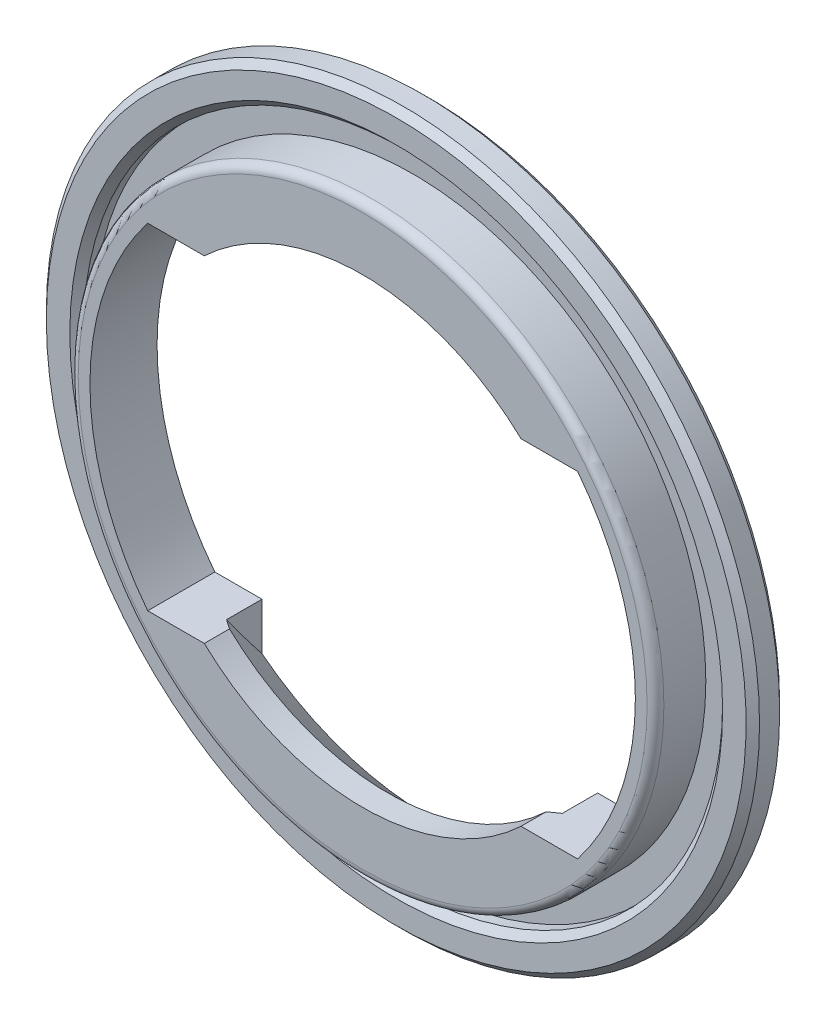
ISO-10303-21;
HEADER;
FILE_DESCRIPTION(('STEP AP214'),'2;1');
FILE_NAME('part.step','',(''),(''),'','','');
FILE_SCHEMA(('AUTOMOTIVE_DESIGN { 1 0 10303 214 1 1 1 1 }'));
ENDSEC;
DATA;
#1=APPLICATION_CONTEXT('core data for automotive mechanical design processes');
#2=APPLICATION_PROTOCOL_DEFINITION('international standard','automotive_design',2000,#1);
#3=PRODUCT_CONTEXT('',#1,'mechanical');
#4=PRODUCT('Part','Part','',(#3));
#5=PRODUCT_RELATED_PRODUCT_CATEGORY('part','',(#4));
#6=PRODUCT_DEFINITION_FORMATION('','',#4);
#7=PRODUCT_DEFINITION_CONTEXT('part definition',#1,'design');
#8=PRODUCT_DEFINITION('design','',#6,#7);
#9=PRODUCT_DEFINITION_SHAPE('','',#8);
#10=(LENGTH_UNIT() NAMED_UNIT(*) SI_UNIT(.MILLI.,.METRE.));
#11=(NAMED_UNIT(*) PLANE_ANGLE_UNIT() SI_UNIT($,.RADIAN.));
#12=(NAMED_UNIT(*) SI_UNIT($,.STERADIAN.) SOLID_ANGLE_UNIT());
#13=UNCERTAINTY_MEASURE_WITH_UNIT(LENGTH_MEASURE(1.E-05),#10,'distance_accuracy_value','');
#14=(GEOMETRIC_REPRESENTATION_CONTEXT(3) GLOBAL_UNCERTAINTY_ASSIGNED_CONTEXT((#13)) GLOBAL_UNIT_ASSIGNED_CONTEXT((#10,
#11,#12)) REPRESENTATION_CONTEXT('',''));
#15=CARTESIAN_POINT('',(0.,0.,0.));
#16=DIRECTION('',(0.,0.,1.));
#17=DIRECTION('',(1.,0.,0.));
#18=AXIS2_PLACEMENT_3D('',#15,#16,#17);
#19=CARTESIAN_POINT('',(0.,0.,28.0821917808219));
#20=DIRECTION('',(0.,0.,1.));
#21=DIRECTION('',(1.,0.,0.));
#22=AXIS2_PLACEMENT_3D('',#19,#20,#21);
#23=CYLINDRICAL_SURFACE('',#22,27.5);
#24=CARTESIAN_POINT('',(0.,0.,-3.));
#25=DIRECTION('',(0.,0.,-1.));
#26=DIRECTION('',(-1.,0.,0.));
#27=AXIS2_PLACEMENT_3D('',#24,#25,#26);
#28=CIRCLE('',#27,27.5);
#29=CARTESIAN_POINT('',(18.8745860881769,20.,-3.));
#30=VERTEX_POINT('',#29);
#31=CARTESIAN_POINT('',(-18.8745860881769,20.,-3.));
#32=VERTEX_POINT('',#31);
#33=EDGE_CURVE('E196',#30,#32,#28,.F.);
#34=ORIENTED_EDGE('',*,*,#33,.F.);
#35=DIRECTION('',(0.,0.,1.));
#36=VECTOR('',#35,1.);
#37=CARTESIAN_POINT('',(18.8745860881769,20.,28.0821917808219));
#38=LINE('',#37,#36);
#39=CARTESIAN_POINT('',(18.8745860881769,20.,0.));
#40=VERTEX_POINT('',#39);
#41=EDGE_CURVE('E408',#40,#30,#38,.F.);
#42=ORIENTED_EDGE('',*,*,#41,.F.);
#43=CARTESIAN_POINT('',(0.,0.,0.));
#44=DIRECTION('',(0.,0.,1.));
#45=DIRECTION('',(1.,0.,0.));
#46=AXIS2_PLACEMENT_3D('',#43,#44,#45);
#47=CIRCLE('',#46,27.5);
#48=CARTESIAN_POINT('',(-18.8745860881769,20.,0.));
#49=VERTEX_POINT('',#48);
#50=EDGE_CURVE('E418',#40,#49,#47,.T.);
#51=ORIENTED_EDGE('',*,*,#50,.T.);
#52=DIRECTION('',(0.,0.,1.));
#53=VECTOR('',#52,1.);
#54=CARTESIAN_POINT('',(-18.8745860881769,20.,28.0821917808219));
#55=LINE('',#54,#53);
#56=EDGE_CURVE('E405',#32,#49,#55,.T.);
#57=ORIENTED_EDGE('',*,*,#56,.F.);
#58=EDGE_LOOP('',(#34,#42,#51,#57));
#59=FACE_BOUND('',#58,.T.);
#60=ADVANCED_FACE('F36',(#59),#23,.F.);
#61=CARTESIAN_POINT('',(0.,0.,-8.));
#62=DIRECTION('',(0.,0.,-1.));
#63=DIRECTION('',(-1.,0.,0.));
#64=AXIS2_PLACEMENT_3D('',#61,#62,#63);
#65=CONICAL_SURFACE('',#64,28.3,0.785398163397442);
#66=CARTESIAN_POINT('',(0.,0.,-8.));
#67=DIRECTION('',(0.,0.,1.));
#68=DIRECTION('',(1.,0.,0.));
#69=AXIS2_PLACEMENT_3D('',#66,#67,#68);
#70=CIRCLE('',#69,28.3);
#71=CARTESIAN_POINT('',(-20.,20.0222376371873,-8.));
#72=VERTEX_POINT('',#71);
#73=CARTESIAN_POINT('',(-20.0222376371873,20.,-8.));
#74=VERTEX_POINT('',#73);
#75=EDGE_CURVE('E429',#72,#74,#70,.T.);
#76=ORIENTED_EDGE('',*,*,#75,.F.);
#77=CARTESIAN_POINT('',(-20.,27.4636148764837,-13.6742570497696));
#78=CARTESIAN_POINT('',(-20.,26.9400176394358,-13.2510434309802));
#79=CARTESIAN_POINT('',(-20.,26.414401457281,-12.8303067182426));
#80=CARTESIAN_POINT('',(-20.,25.3584905949147,-11.9947064751424));
#81=CARTESIAN_POINT('',(-20.,24.8281957336181,-11.5798431737389));
#82=CARTESIAN_POINT('',(-20.,23.7630525449101,-10.7575019289592));
#83=CARTESIAN_POINT('',(-20.,23.2282113936961,-10.3500147060618));
#84=CARTESIAN_POINT('',(-20.,22.1525072374824,-9.54303963473138));
#85=CARTESIAN_POINT('',(-20.,21.6116441456833,-9.14355190183476));
#86=CARTESIAN_POINT('',(-20.,20.5226537266135,-8.3537721076442));
#87=CARTESIAN_POINT('',(-20.,19.97452158685,-7.96348666790359));
#88=CARTESIAN_POINT('',(-20.,18.8703927401923,-7.19426946554557));
#89=CARTESIAN_POINT('',(-20.,18.3143966134008,-6.81533687182659));
#90=CARTESIAN_POINT('',(-20.,17.1925761380692,-6.07059691832123));
#91=CARTESIAN_POINT('',(-20.,16.6267397246452,-5.70480764621374));
#92=CARTESIAN_POINT('',(-20.,15.7701117488427,-5.16854738094426));
#93=CARTESIAN_POINT('',(-20.,15.4832175572613,-4.991841523961));
#94=CARTESIAN_POINT('',(-20.,14.9066261607875,-4.6430328285595));
#95=CARTESIAN_POINT('',(-20.,14.6169288147771,-4.4709302235399));
#96=CARTESIAN_POINT('',(-20.,14.3257429502304,-4.30135994363062));
#97=B_SPLINE_CURVE_WITH_KNOTS('',3,(#77,#78,#79,#80,#81,#82,#83,#84,#85,#86,#87,#88,#89,#90,#91,
#92,#93,#94,#95,#96),.UNSPECIFIED.,.F.,.F.,(4,2,2,2,2,2,2,2,2,4),(0.,2.01975813535382,
4.03959478996089,6.05668357397876,8.07380146977579,10.0923290391449,12.1107084764033,
14.1317667631096,15.1425691699538,16.1534227307229),.UNSPECIFIED.);
#98=CARTESIAN_POINT('',(-20.,20.,-7.98427124746189));
#99=VERTEX_POINT('',#98);
#100=EDGE_CURVE('E453',#72,#99,#97,.T.);
#101=ORIENTED_EDGE('',*,*,#100,.T.);
#102=CARTESIAN_POINT('',(20.0232270248829,20.,-8.00070000000001));
#103=CARTESIAN_POINT('',(19.7436785693038,20.,-7.80291970780977));
#104=CARTESIAN_POINT('',(19.4631605166588,20.,-7.60651124220242));
#105=CARTESIAN_POINT('',(18.9000219227625,20.,-7.21671283287064));
#106=CARTESIAN_POINT('',(18.6174013121765,20.,-7.0233229893467));
#107=CARTESIAN_POINT('',(17.7659318695407,20.,-6.44795331756512));
#108=CARTESIAN_POINT('',(17.1937083614906,20.,-6.07093880226928));
#109=CARTESIAN_POINT('',(16.0317493042842,20.,-5.32839778554733));
#110=CARTESIAN_POINT('',(15.4418843725988,20.,-4.96307309261693));
#111=CARTESIAN_POINT('',(14.2500900654365,20.,-4.25272104888336));
#112=CARTESIAN_POINT('',(13.6481620751407,20.,-3.90769138533751));
#113=CARTESIAN_POINT('',(12.4113652480964,20.,-3.23221540940347));
#114=CARTESIAN_POINT('',(11.7760559490994,20.,-2.90257018063006));
#115=CARTESIAN_POINT('',(10.4889407296726,20.,-2.27657438430796));
#116=CARTESIAN_POINT('',(9.83713170116268,20.,-1.98023014777135));
#117=CARTESIAN_POINT('',(8.51922395365659,20.,-1.43062969296445));
#118=CARTESIAN_POINT('',(7.85321193540946,20.,-1.17716745825001));
#119=CARTESIAN_POINT('',(6.50398771337576,20.,-0.721411113212666));
#120=CARTESIAN_POINT('',(5.82078661098829,20.,-0.519084864915172));
#121=CARTESIAN_POINT('',(4.80336046574302,20.,-0.266281785997138));
#122=CARTESIAN_POINT('',(4.47496750642687,20.,-0.191971799651674));
#123=CARTESIAN_POINT('',(3.8152085780237,20.,-0.0580835184166812));
#124=CARTESIAN_POINT('',(3.48384301971432,20.,0.0014967804068467));
#125=CARTESIAN_POINT('',(2.81856301003291,20.,0.105042987525139));
#126=CARTESIAN_POINT('',(2.48464775735628,20.,0.149003761730995));
#127=CARTESIAN_POINT('',(1.81505578351882,20.,0.220566827937985));
#128=CARTESIAN_POINT('',(1.47937904720048,20.,0.24816897894012));
#129=CARTESIAN_POINT('',(0.811789772154226,20.,0.286266851006239));
#130=CARTESIAN_POINT('',(0.479890691359999,20.,0.296997703229757));
#131=CARTESIAN_POINT('',(-0.184028527002854,20.,0.301908131482201));
#132=CARTESIAN_POINT('',(-0.516048663678199,20.,0.296087827267026));
#133=CARTESIAN_POINT('',(-1.17938590953977,20.,0.267997066546096));
#134=CARTESIAN_POINT('',(-1.51070302516225,20.,0.245726761299852));
#135=CARTESIAN_POINT('',(-2.17185735789146,20.,0.18511528169715));
#136=CARTESIAN_POINT('',(-2.50169456867268,20.,0.146774038715164));
#137=CARTESIAN_POINT('',(-3.15696907717575,20.,0.0549528628154587));
#138=CARTESIAN_POINT('',(-3.48242104433814,20.,0.00157730690424268));
#139=CARTESIAN_POINT('',(-4.13063927664447,20.,-0.119616152504603));
#140=CARTESIAN_POINT('',(-4.45340520224689,20.,-0.187435853909635));
#141=CARTESIAN_POINT('',(-5.41694183388231,20.,-0.41118731673326));
#142=CARTESIAN_POINT('',(-6.05306865107276,20.,-0.587428449095514));
#143=CARTESIAN_POINT('',(-7.31871300047359,20.,-0.988446970722365));
#144=CARTESIAN_POINT('',(-7.94803460526517,20.,-1.21383027988622));
#145=CARTESIAN_POINT('',(-9.19123386949648,20.,-1.70345966154817));
#146=CARTESIAN_POINT('',(-9.80511186785428,20.,-1.96770488032841));
#147=CARTESIAN_POINT('',(-10.8425173495956,20.,-2.44674011966137));
#148=CARTESIAN_POINT('',(-11.2697066834235,20.,-2.65370387565659));
#149=CARTESIAN_POINT('',(-12.1171468476627,20.,-3.08143309489274));
#150=CARTESIAN_POINT('',(-12.5373972282369,20.,-3.30219944851983));
#151=CARTESIAN_POINT('',(-13.3716510792254,20.,-3.75573571624505));
#152=CARTESIAN_POINT('',(-13.7856509130296,20.,-3.98851229456659));
#153=CARTESIAN_POINT('',(-14.6077051512683,20.,-4.46434357125389));
#154=CARTESIAN_POINT('',(-15.0157593688964,20.,-4.7073985916274));
#155=CARTESIAN_POINT('',(-15.8140340056422,20.,-5.19483960343645));
#156=CARTESIAN_POINT('',(-16.2044183028579,20.,-5.43895784739114));
#157=CARTESIAN_POINT('',(-16.9805270375857,20.,-5.93450266128216));
#158=CARTESIAN_POINT('',(-17.3662513605837,20.,-6.18592941030233));
#159=CARTESIAN_POINT('',(-18.1327518006563,20.,-6.69471405515383));
#160=CARTESIAN_POINT('',(-18.5135356293552,20.,-6.95206035520273));
#161=CARTESIAN_POINT('',(-19.2712032795324,20.,-7.47235690044798));
#162=CARTESIAN_POINT('',(-19.6480874765652,20.,-7.73530659840406));
#163=CARTESIAN_POINT('',(-20.0232270248829,20.,-8.00070000000001));
#164=B_SPLINE_CURVE_WITH_KNOTS('',3,(#102,#103,#104,#105,#106,#107,#108,#109,#110,#111,#112,
#113,#114,#115,#116,#117,#118,#119,#120,#121,#122,#123,#124,#125,#126,#127,#128,#129,#130,#131,
#132,#133,#134,#135,#136,#137,#138,#139,#140,#141,#142,#143,#144,#145,#146,#147,#148,#149,#150,
#151,#152,#153,#154,#155,#156,#157,#158,#159,#160,#161,#162,#163),.UNSPECIFIED.,.F.,.F.,(4,2,2,
2,2,2,2,2,2,2,2,2,2,2,2,2,2,2,2,2,2,2,2,2,2,2,2,2,2,2,4),(0.,1.02730901077004,2.05465204994527,
4.11019508478165,6.19136354482817,8.27229438170184,10.4187374283151,12.5655878576303,
14.70181180887,16.8366898274646,17.8465003155718,18.8561733460087,19.8661779464594,
20.8761912522616,21.8719993643707,22.8678002713282,23.8635920219044,24.8593880247172,
25.848434171168,26.8376034992728,28.8155879028914,30.8194992007203,32.8233664832291,
34.2471705746944,35.6710666087161,37.0957614127769,38.5205008834449,39.9016932205685,
41.2829194302914,42.6616382109699,44.0402229544717),.UNSPECIFIED.);
#165=EDGE_CURVE('E293',#99,#74,#164,.T.);
#166=ORIENTED_EDGE('',*,*,#165,.T.);
#167=EDGE_LOOP('',(#76,#101,#166));
#168=FACE_BOUND('',#167,.T.);
#169=ADVANCED_FACE('F371',(#168),#65,.F.);
#170=CARTESIAN_POINT('',(0.,0.,-3.));
#171=DIRECTION('',(0.,0.,-1.));
#172=DIRECTION('',(-1.,0.,0.));
#173=AXIS2_PLACEMENT_3D('',#170,#171,#172);
#174=CIRCLE('',#173,27.5);
#175=CARTESIAN_POINT('',(-18.8745860881769,-20.,-3.));
#176=VERTEX_POINT('',#175);
#177=CARTESIAN_POINT('',(18.8745860881769,-20.,-3.));
#178=VERTEX_POINT('',#177);
#179=EDGE_CURVE('E193',#176,#178,#174,.F.);
#180=ORIENTED_EDGE('',*,*,#179,.F.);
#181=DIRECTION('',(0.,0.,1.));
#182=VECTOR('',#181,1.);
#183=CARTESIAN_POINT('',(-18.8745860881769,-20.,28.0821917808219));
#184=LINE('',#183,#182);
#185=CARTESIAN_POINT('',(-18.8745860881769,-20.,0.));
#186=VERTEX_POINT('',#185);
#187=EDGE_CURVE('E388',#176,#186,#184,.T.);
#188=ORIENTED_EDGE('',*,*,#187,.T.);
#189=CARTESIAN_POINT('',(18.8745860881769,-20.,0.));
#190=VERTEX_POINT('',#189);
#191=EDGE_CURVE('E417',#186,#190,#47,.T.);
#192=ORIENTED_EDGE('',*,*,#191,.T.);
#193=DIRECTION('',(0.,0.,1.));
#194=VECTOR('',#193,1.);
#195=CARTESIAN_POINT('',(18.8745860881769,-20.,28.0821917808219));
#196=LINE('',#195,#194);
#197=EDGE_CURVE('E390',#190,#178,#196,.F.);
#198=ORIENTED_EDGE('',*,*,#197,.T.);
#199=EDGE_LOOP('',(#180,#188,#192,#198));
#200=FACE_BOUND('',#199,.T.);
#201=ADVANCED_FACE('F373',(#200),#23,.F.);
#202=CARTESIAN_POINT('',(20.0232270248829,-20.,-8.00070000000001));
#203=CARTESIAN_POINT('',(19.7436785693038,-20.,-7.80291970780977));
#204=CARTESIAN_POINT('',(19.4631605166588,-20.,-7.60651124220242));
#205=CARTESIAN_POINT('',(18.9000219227625,-20.,-7.21671283287064));
#206=CARTESIAN_POINT('',(18.6174013121765,-20.,-7.0233229893467));
#207=CARTESIAN_POINT('',(17.7659318695407,-20.,-6.44795331756512));
#208=CARTESIAN_POINT('',(17.1937083614906,-20.,-6.07093880226928));
#209=CARTESIAN_POINT('',(16.0317493042842,-20.,-5.32839778554733));
#210=CARTESIAN_POINT('',(15.4418843725988,-20.,-4.96307309261693));
#211=CARTESIAN_POINT('',(14.2500900654365,-20.,-4.25272104888336));
#212=CARTESIAN_POINT('',(13.6481620751407,-20.,-3.90769138533751));
#213=CARTESIAN_POINT('',(12.4113652480964,-20.,-3.23221540940347));
#214=CARTESIAN_POINT('',(11.7760559490994,-20.,-2.90257018063006));
#215=CARTESIAN_POINT('',(10.4889407296726,-20.,-2.27657438430796));
#216=CARTESIAN_POINT('',(9.83713170116268,-20.,-1.98023014777135));
#217=CARTESIAN_POINT('',(8.51922395365659,-20.,-1.43062969296445));
#218=CARTESIAN_POINT('',(7.85321193540946,-20.,-1.17716745825001));
#219=CARTESIAN_POINT('',(6.50398771337576,-20.,-0.721411113212666));
#220=CARTESIAN_POINT('',(5.82078661098829,-20.,-0.519084864915172));
#221=CARTESIAN_POINT('',(4.80336046574302,-20.,-0.266281785997138));
#222=CARTESIAN_POINT('',(4.47496750642687,-20.,-0.191971799651674));
#223=CARTESIAN_POINT('',(3.8152085780237,-20.,-0.0580835184166812));
#224=CARTESIAN_POINT('',(3.48384301971432,-20.,0.0014967804068467));
#225=CARTESIAN_POINT('',(2.81856301003291,-20.,0.105042987525139));
#226=CARTESIAN_POINT('',(2.48464775735628,-20.,0.149003761730995));
#227=CARTESIAN_POINT('',(1.81505578351882,-20.,0.220566827937985));
#228=CARTESIAN_POINT('',(1.47937904720048,-20.,0.24816897894012));
#229=CARTESIAN_POINT('',(0.811789772154226,-20.,0.286266851006239));
#230=CARTESIAN_POINT('',(0.479890691359999,-20.,0.296997703229757));
#231=CARTESIAN_POINT('',(-0.184028527002854,-20.,0.301908131482201));
#232=CARTESIAN_POINT('',(-0.516048663678199,-20.,0.296087827267026));
#233=CARTESIAN_POINT('',(-1.17938590953977,-20.,0.267997066546096));
#234=CARTESIAN_POINT('',(-1.51070302516225,-20.,0.245726761299852));
#235=CARTESIAN_POINT('',(-2.17185735789146,-20.,0.18511528169715));
#236=CARTESIAN_POINT('',(-2.50169456867268,-20.,0.146774038715164));
#237=CARTESIAN_POINT('',(-3.15696907717575,-20.,0.0549528628154587));
#238=CARTESIAN_POINT('',(-3.48242104433814,-20.,0.00157730690424268));
#239=CARTESIAN_POINT('',(-4.13063927664447,-20.,-0.119616152504603));
#240=CARTESIAN_POINT('',(-4.45340520224689,-20.,-0.187435853909635));
#241=CARTESIAN_POINT('',(-5.41694183388231,-20.,-0.41118731673326));
#242=CARTESIAN_POINT('',(-6.05306865107276,-20.,-0.587428449095514));
#243=CARTESIAN_POINT('',(-7.31871300047359,-20.,-0.988446970722365));
#244=CARTESIAN_POINT('',(-7.94803460526517,-20.,-1.21383027988622));
#245=CARTESIAN_POINT('',(-9.19123386949648,-20.,-1.70345966154817));
#246=CARTESIAN_POINT('',(-9.80511186785428,-20.,-1.96770488032841));
#247=CARTESIAN_POINT('',(-10.8425173495956,-20.,-2.44674011966137));
#248=CARTESIAN_POINT('',(-11.2697066834235,-20.,-2.65370387565659));
#249=CARTESIAN_POINT('',(-12.1171468476627,-20.,-3.08143309489274));
#250=CARTESIAN_POINT('',(-12.5373972282369,-20.,-3.30219944851983));
#251=CARTESIAN_POINT('',(-13.3716510792254,-20.,-3.75573571624505));
#252=CARTESIAN_POINT('',(-13.7856509130296,-20.,-3.98851229456659));
#253=CARTESIAN_POINT('',(-14.6077051512683,-20.,-4.46434357125389));
#254=CARTESIAN_POINT('',(-15.0157593688964,-20.,-4.7073985916274));
#255=CARTESIAN_POINT('',(-15.8140340056422,-20.,-5.19483960343645));
#256=CARTESIAN_POINT('',(-16.2044183028579,-20.,-5.43895784739114));
#257=CARTESIAN_POINT('',(-16.9805270375857,-20.,-5.93450266128216));
#258=CARTESIAN_POINT('',(-17.3662513605837,-20.,-6.18592941030233));
#259=CARTESIAN_POINT('',(-18.1327518006563,-20.,-6.69471405515383));
#260=CARTESIAN_POINT('',(-18.5135356293552,-20.,-6.95206035520273));
#261=CARTESIAN_POINT('',(-19.2712032795324,-20.,-7.47235690044798));
#262=CARTESIAN_POINT('',(-19.6480874765652,-20.,-7.73530659840406));
#263=CARTESIAN_POINT('',(-20.0232270248829,-20.,-8.00070000000001));
#264=B_SPLINE_CURVE_WITH_KNOTS('',3,(#202,#203,#204,#205,#206,#207,#208,#209,#210,#211,#212,
#213,#214,#215,#216,#217,#218,#219,#220,#221,#222,#223,#224,#225,#226,#227,#228,#229,#230,#231,
#232,#233,#234,#235,#236,#237,#238,#239,#240,#241,#242,#243,#244,#245,#246,#247,#248,#249,#250,
#251,#252,#253,#254,#255,#256,#257,#258,#259,#260,#261,#262,#263),.UNSPECIFIED.,.F.,.F.,(4,2,2,
2,2,2,2,2,2,2,2,2,2,2,2,2,2,2,2,2,2,2,2,2,2,2,2,2,2,2,4),(0.,1.02730901077004,2.05465204994527,
4.11019508478165,6.19136354482817,8.27229438170184,10.4187374283151,12.5655878576303,
14.70181180887,16.8366898274646,17.8465003155718,18.8561733460087,19.8661779464594,
20.8761912522616,21.8719993643707,22.8678002713282,23.8635920219044,24.8593880247172,
25.848434171168,26.8376034992728,28.8155879028914,30.8194992007203,32.8233664832291,
34.2471705746944,35.6710666087161,37.0957614127769,38.5205008834449,39.9016932205685,
41.2829194302914,42.6616382109699,44.0402229544717),.UNSPECIFIED.);
#265=CARTESIAN_POINT('',(-20.,-20.,-7.98427124746189));
#266=VERTEX_POINT('',#265);
#267=CARTESIAN_POINT('',(-20.0222376371873,-20.,-8.));
#268=VERTEX_POINT('',#267);
#269=EDGE_CURVE('E303',#266,#268,#264,.T.);
#270=ORIENTED_EDGE('',*,*,#269,.F.);
#271=CARTESIAN_POINT('',(-20.,-14.3257429502304,-4.30135994363061));
#272=CARTESIAN_POINT('',(-20.,-14.6169288147771,-4.47093022353989));
#273=CARTESIAN_POINT('',(-20.,-14.9066261607874,-4.64303282855949));
#274=CARTESIAN_POINT('',(-20.,-15.4832175572612,-4.991841523961));
#275=CARTESIAN_POINT('',(-20.,-15.7701117488427,-5.16854738094426));
#276=CARTESIAN_POINT('',(-20.,-16.6267397246452,-5.70480764621374));
#277=CARTESIAN_POINT('',(-20.,-17.1925761380692,-6.07059691832122));
#278=CARTESIAN_POINT('',(-20.,-18.3143966134008,-6.81533687182659));
#279=CARTESIAN_POINT('',(-20.,-18.8703927401923,-7.19426946554557));
#280=CARTESIAN_POINT('',(-20.,-19.97452158685,-7.96348666790359));
#281=CARTESIAN_POINT('',(-20.,-20.5226537266135,-8.3537721076442));
#282=CARTESIAN_POINT('',(-20.,-21.6116441456833,-9.14355190183476));
#283=CARTESIAN_POINT('',(-20.,-22.1525072374824,-9.54303963473137));
#284=CARTESIAN_POINT('',(-20.,-23.2282113936961,-10.3500147060618));
#285=CARTESIAN_POINT('',(-20.,-23.7630525449101,-10.7575019289592));
#286=CARTESIAN_POINT('',(-20.,-24.8281957336181,-11.5798431737389));
#287=CARTESIAN_POINT('',(-20.,-25.3584905949147,-11.9947064751423));
#288=CARTESIAN_POINT('',(-20.,-26.414401457281,-12.8303067182426));
#289=CARTESIAN_POINT('',(-20.,-26.9400176394358,-13.2510434309802));
#290=CARTESIAN_POINT('',(-20.,-27.4636148764837,-13.6742570497696));
#291=B_SPLINE_CURVE_WITH_KNOTS('',3,(#271,#272,#273,#274,#275,#276,#277,#278,#279,#280,#281,
#282,#283,#284,#285,#286,#287,#288,#289,#290),.UNSPECIFIED.,.F.,.F.,(4,2,2,2,2,2,2,2,2,4),(0.,
1.01085356076915,2.02165596761335,4.04271425431964,6.06109369157801,8.07962126094713,
10.0967391567442,12.113827940762,14.1336645953691,16.1534227307229),.UNSPECIFIED.);
#292=CARTESIAN_POINT('',(-20.,-20.0222376371873,-8.));
#293=VERTEX_POINT('',#292);
#294=EDGE_CURVE('E483',#266,#293,#291,.T.);
#295=ORIENTED_EDGE('',*,*,#294,.T.);
#296=EDGE_CURVE('E179',#268,#293,#70,.T.);
#297=ORIENTED_EDGE('',*,*,#296,.F.);
#298=EDGE_LOOP('',(#270,#295,#297));
#299=FACE_BOUND('',#298,.T.);
#300=ADVANCED_FACE('F378',(#299),#65,.F.);
#301=CARTESIAN_POINT('',(0.,-20.,-10.));
#302=DIRECTION('',(0.,-1.,0.));
#303=DIRECTION('',(0.,0.,-1.));
#304=AXIS2_PLACEMENT_3D('',#301,#302,#303);
#305=PLANE('',#304);
#306=DIRECTION('',(0.,0.,1.));
#307=VECTOR('',#306,1.);
#308=CARTESIAN_POINT('',(-20.,-20.,-10.));
#309=LINE('',#308,#307);
#310=CARTESIAN_POINT('',(-20.,-20.,-3.78427124746188));
#311=VERTEX_POINT('',#310);
#312=EDGE_CURVE('E166',#266,#311,#309,.T.);
#313=ORIENTED_EDGE('',*,*,#312,.F.);
#314=ORIENTED_EDGE('',*,*,#269,.T.);
#315=DIRECTION('',(1.,0.,0.));
#316=VECTOR('',#315,1.);
#317=CARTESIAN_POINT('',(0.,-20.,-8.));
#318=LINE('',#317,#316);
#319=CARTESIAN_POINT('',(-25.617376914899,-20.,-8.));
#320=VERTEX_POINT('',#319);
#321=EDGE_CURVE('E395',#320,#268,#318,.T.);
#322=ORIENTED_EDGE('',*,*,#321,.F.);
#323=DIRECTION('',(0.,0.,1.));
#324=VECTOR('',#323,1.);
#325=CARTESIAN_POINT('',(-25.617376914899,-20.,-10.));
#326=LINE('',#325,#324);
#327=CARTESIAN_POINT('',(-25.617376914899,-20.,0.));
#328=VERTEX_POINT('',#327);
#329=EDGE_CURVE('E468',#320,#328,#326,.T.);
#330=ORIENTED_EDGE('',*,*,#329,.T.);
#331=DIRECTION('',(1.,0.,0.));
#332=VECTOR('',#331,1.);
#333=CARTESIAN_POINT('',(0.,-20.,0.));
#334=LINE('',#333,#332);
#335=EDGE_CURVE('E392',#328,#186,#334,.T.);
#336=ORIENTED_EDGE('',*,*,#335,.T.);
#337=ORIENTED_EDGE('',*,*,#187,.F.);
#338=CARTESIAN_POINT('',(-18.8745860881769,-20.,-3.));
#339=CARTESIAN_POINT('',(-19.0630681307054,-20.,-3.12940172388548));
#340=CARTESIAN_POINT('',(-19.2510936606276,-20.,-3.2594585344378));
#341=CARTESIAN_POINT('',(-19.6262316309221,-20.,-3.52088228404115));
#342=CARTESIAN_POINT('',(-19.8133440716076,-20.,-3.6522492226428));
#343=CARTESIAN_POINT('',(-20.,-20.,-3.78427124746188));
#344=B_SPLINE_CURVE_WITH_KNOTS('',3,(#338,#339,#340,#341,#342,#343),.UNSPECIFIED.,.F.,.F.,(4,2,
4),(0.,0.685868329099727,1.37173642294264),.UNSPECIFIED.);
#345=EDGE_CURVE('E59',#176,#311,#344,.T.);
#346=ORIENTED_EDGE('',*,*,#345,.T.);
#347=EDGE_LOOP('',(#313,#314,#322,#330,#336,#337,#346));
#348=FACE_BOUND('',#347,.T.);
#349=ADVANCED_FACE('F340',(#348),#305,.F.);
#350=CARTESIAN_POINT('',(0.,20.,-10.));
#351=DIRECTION('',(0.,-1.,0.));
#352=DIRECTION('',(0.,0.,-1.));
#353=AXIS2_PLACEMENT_3D('',#350,#351,#352);
#354=PLANE('',#353);
#355=ORIENTED_EDGE('',*,*,#165,.F.);
#356=DIRECTION('',(0.,0.,1.));
#357=VECTOR('',#356,1.);
#358=CARTESIAN_POINT('',(-20.,20.,-10.));
#359=LINE('',#358,#357);
#360=CARTESIAN_POINT('',(-20.,20.,-3.78427124746188));
#361=VERTEX_POINT('',#360);
#362=EDGE_CURVE('E242',#99,#361,#359,.T.);
#363=ORIENTED_EDGE('',*,*,#362,.T.);
#364=CARTESIAN_POINT('',(-20.,20.,-3.78427124746188));
#365=CARTESIAN_POINT('',(-19.8133440716076,20.,-3.6522492226428));
#366=CARTESIAN_POINT('',(-19.6262316309221,20.,-3.52088228404115));
#367=CARTESIAN_POINT('',(-19.2510936606276,20.,-3.2594585344378));
#368=CARTESIAN_POINT('',(-19.0630681307054,20.,-3.12940172388548));
#369=CARTESIAN_POINT('',(-18.8745860881769,20.,-3.));
#370=B_SPLINE_CURVE_WITH_KNOTS('',3,(#364,#365,#366,#367,#368,#369),.UNSPECIFIED.,.F.,.F.,(4,2,
4),(0.,0.68586809384291,1.37173642294264),.UNSPECIFIED.);
#371=EDGE_CURVE('E271',#361,#32,#370,.T.);
#372=ORIENTED_EDGE('',*,*,#371,.T.);
#373=ORIENTED_EDGE('',*,*,#56,.T.);
#374=DIRECTION('',(1.,0.,0.));
#375=VECTOR('',#374,1.);
#376=CARTESIAN_POINT('',(0.,20.,0.));
#377=LINE('',#376,#375);
#378=CARTESIAN_POINT('',(-25.617376914899,20.,0.));
#379=VERTEX_POINT('',#378);
#380=EDGE_CURVE('E457',#379,#49,#377,.T.);
#381=ORIENTED_EDGE('',*,*,#380,.F.);
#382=DIRECTION('',(0.,0.,1.));
#383=VECTOR('',#382,1.);
#384=CARTESIAN_POINT('',(-25.617376914899,20.,-10.));
#385=LINE('',#384,#383);
#386=CARTESIAN_POINT('',(-25.617376914899,20.,-8.));
#387=VERTEX_POINT('',#386);
#388=EDGE_CURVE('E399',#387,#379,#385,.T.);
#389=ORIENTED_EDGE('',*,*,#388,.F.);
#390=DIRECTION('',(1.,0.,0.));
#391=VECTOR('',#390,1.);
#392=CARTESIAN_POINT('',(0.,20.,-8.));
#393=LINE('',#392,#391);
#394=EDGE_CURVE('E403',#387,#74,#393,.T.);
#395=ORIENTED_EDGE('',*,*,#394,.T.);
#396=EDGE_LOOP('',(#355,#363,#372,#373,#381,#389,#395));
#397=FACE_BOUND('',#396,.T.);
#398=ADVANCED_FACE('F287',(#397),#354,.T.);
#399=CARTESIAN_POINT('',(0.,27.5,0.));
#400=DIRECTION('',(0.,0.,-1.));
#401=DIRECTION('',(-1.,0.,0.));
#402=AXIS2_PLACEMENT_3D('',#399,#400,#401);
#403=PLANE('',#402);
#404=CARTESIAN_POINT('',(0.,0.,0.));
#405=DIRECTION('',(0.,0.,-1.));
#406=DIRECTION('',(-1.,0.,0.));
#407=AXIS2_PLACEMENT_3D('',#404,#405,#406);
#408=CIRCLE('',#407,33.9);
#409=CARTESIAN_POINT('',(-33.9,0.,0.));
#410=VERTEX_POINT('',#409);
#411=EDGE_CURVE('E44',#410,#410,#408,.F.);
#412=ORIENTED_EDGE('',*,*,#411,.T.);
#413=EDGE_LOOP('',(#412));
#414=FACE_BOUND('',#413,.T.);
#415=CARTESIAN_POINT('',(25.617376914899,20.,0.));
#416=VERTEX_POINT('',#415);
#417=EDGE_CURVE('E470',#40,#416,#377,.T.);
#418=ORIENTED_EDGE('',*,*,#417,.T.);
#419=CARTESIAN_POINT('',(0.,0.,0.));
#420=DIRECTION('',(0.,0.,1.));
#421=DIRECTION('',(1.,0.,0.));
#422=AXIS2_PLACEMENT_3D('',#419,#420,#421);
#423=CIRCLE('',#422,32.5);
#424=CARTESIAN_POINT('',(25.617376914899,-20.,0.));
#425=VERTEX_POINT('',#424);
#426=EDGE_CURVE('E474',#425,#416,#423,.T.);
#427=ORIENTED_EDGE('',*,*,#426,.F.);
#428=EDGE_CURVE('E481',#190,#425,#334,.T.);
#429=ORIENTED_EDGE('',*,*,#428,.F.);
#430=ORIENTED_EDGE('',*,*,#191,.F.);
#431=ORIENTED_EDGE('',*,*,#335,.F.);
#432=EDGE_CURVE('E478',#379,#328,#423,.T.);
#433=ORIENTED_EDGE('',*,*,#432,.F.);
#434=ORIENTED_EDGE('',*,*,#380,.T.);
#435=ORIENTED_EDGE('',*,*,#50,.F.);
#436=EDGE_LOOP('',(#418,#427,#429,#430,#431,#433,#434,#435));
#437=FACE_BOUND('',#436,.T.);
#438=ADVANCED_FACE('F346',(#414,#437),#403,.F.);
#439=CARTESIAN_POINT('',(0.,42.5,-8.));
#440=DIRECTION('',(0.,0.,1.));
#441=DIRECTION('',(1.,0.,0.));
#442=AXIS2_PLACEMENT_3D('',#439,#440,#441);
#443=PLANE('',#442);
#444=CARTESIAN_POINT('',(0.,0.,-8.));
#445=DIRECTION('',(0.,0.,1.));
#446=DIRECTION('',(1.,0.,0.));
#447=AXIS2_PLACEMENT_3D('',#444,#445,#446);
#448=CIRCLE('',#447,41.7);
#449=CARTESIAN_POINT('',(41.7,0.,-8.));
#450=VERTEX_POINT('',#449);
#451=EDGE_CURVE('E421',#450,#450,#448,.F.);
#452=ORIENTED_EDGE('',*,*,#451,.T.);
#453=EDGE_LOOP('',(#452));
#454=FACE_BOUND('',#453,.T.);
#455=CARTESIAN_POINT('',(0.,0.,-8.));
#456=DIRECTION('',(0.,0.,-1.));
#457=DIRECTION('',(-1.,0.,0.));
#458=AXIS2_PLACEMENT_3D('',#455,#456,#457);
#459=CIRCLE('',#458,32.5);
#460=CARTESIAN_POINT('',(20.,-25.617376914899,-8.));
#461=VERTEX_POINT('',#460);
#462=CARTESIAN_POINT('',(-20.,-25.617376914899,-8.));
#463=VERTEX_POINT('',#462);
#464=EDGE_CURVE('E176',#461,#463,#459,.T.);
#465=ORIENTED_EDGE('',*,*,#464,.F.);
#466=DIRECTION('',(0.,-1.,0.));
#467=VECTOR('',#466,1.);
#468=CARTESIAN_POINT('',(20.,0.,-8.));
#469=LINE('',#468,#467);
#470=CARTESIAN_POINT('',(20.,-20.0222376371873,-8.));
#471=VERTEX_POINT('',#470);
#472=EDGE_CURVE('E190',#471,#461,#469,.T.);
#473=ORIENTED_EDGE('',*,*,#472,.F.);
#474=CARTESIAN_POINT('',(20.0222376371873,-20.,-8.));
#475=VERTEX_POINT('',#474);
#476=EDGE_CURVE('E424',#471,#475,#70,.T.);
#477=ORIENTED_EDGE('',*,*,#476,.T.);
#478=CARTESIAN_POINT('',(25.617376914899,-20.,-8.));
#479=VERTEX_POINT('',#478);
#480=EDGE_CURVE('E394',#475,#479,#318,.T.);
#481=ORIENTED_EDGE('',*,*,#480,.T.);
#482=CARTESIAN_POINT('',(0.,0.,-8.));
#483=DIRECTION('',(0.,0.,1.));
#484=DIRECTION('',(1.,0.,0.));
#485=AXIS2_PLACEMENT_3D('',#482,#483,#484);
#486=CIRCLE('',#485,32.5);
#487=CARTESIAN_POINT('',(25.617376914899,20.,-8.));
#488=VERTEX_POINT('',#487);
#489=EDGE_CURVE('E309',#479,#488,#486,.T.);
#490=ORIENTED_EDGE('',*,*,#489,.T.);
#491=CARTESIAN_POINT('',(20.0222376371873,20.,-8.));
#492=VERTEX_POINT('',#491);
#493=EDGE_CURVE('E406',#492,#488,#393,.T.);
#494=ORIENTED_EDGE('',*,*,#493,.F.);
#495=CARTESIAN_POINT('',(20.,20.0222376371873,-8.));
#496=VERTEX_POINT('',#495);
#497=EDGE_CURVE('E425',#492,#496,#70,.T.);
#498=ORIENTED_EDGE('',*,*,#497,.T.);
#499=CARTESIAN_POINT('',(20.,25.617376914899,-8.));
#500=VERTEX_POINT('',#499);
#501=EDGE_CURVE('E191',#500,#496,#469,.T.);
#502=ORIENTED_EDGE('',*,*,#501,.F.);
#503=CARTESIAN_POINT('',(0.,0.,-8.));
#504=DIRECTION('',(0.,0.,-1.));
#505=DIRECTION('',(-1.,0.,0.));
#506=AXIS2_PLACEMENT_3D('',#503,#504,#505);
#507=CIRCLE('',#506,32.5);
#508=CARTESIAN_POINT('',(-20.,25.617376914899,-8.));
#509=VERTEX_POINT('',#508);
#510=EDGE_CURVE('E187',#509,#500,#507,.T.);
#511=ORIENTED_EDGE('',*,*,#510,.F.);
#512=DIRECTION('',(0.,-1.,0.));
#513=VECTOR('',#512,1.);
#514=CARTESIAN_POINT('',(-20.,0.,-8.));
#515=LINE('',#514,#513);
#516=EDGE_CURVE('E180',#509,#72,#515,.T.);
#517=ORIENTED_EDGE('',*,*,#516,.T.);
#518=ORIENTED_EDGE('',*,*,#75,.T.);
#519=ORIENTED_EDGE('',*,*,#394,.F.);
#520=CARTESIAN_POINT('',(0.,0.,-8.));
#521=DIRECTION('',(0.,0.,1.));
#522=DIRECTION('',(1.,0.,0.));
#523=AXIS2_PLACEMENT_3D('',#520,#521,#522);
#524=CIRCLE('',#523,32.5);
#525=EDGE_CURVE('E312',#387,#320,#524,.T.);
#526=ORIENTED_EDGE('',*,*,#525,.T.);
#527=ORIENTED_EDGE('',*,*,#321,.T.);
#528=ORIENTED_EDGE('',*,*,#296,.T.);
#529=EDGE_CURVE('E164',#293,#463,#515,.T.);
#530=ORIENTED_EDGE('',*,*,#529,.T.);
#531=EDGE_LOOP('',(#465,#473,#477,#481,#490,#494,#498,#502,#511,#517,#518,#519,#526,#527,#528,#530));
#532=FACE_BOUND('',#531,.T.);
#533=ADVANCED_FACE('F174',(#454,#532),#443,.F.);
#534=CARTESIAN_POINT('',(20.,27.4636148764837,-13.6742570497696));
#535=CARTESIAN_POINT('',(20.,26.9400176394358,-13.2510434309802));
#536=CARTESIAN_POINT('',(20.,26.414401457281,-12.8303067182426));
#537=CARTESIAN_POINT('',(20.,25.3584905949147,-11.9947064751424));
#538=CARTESIAN_POINT('',(20.,24.8281957336181,-11.5798431737389));
#539=CARTESIAN_POINT('',(20.,23.7630525449101,-10.7575019289592));
#540=CARTESIAN_POINT('',(20.,23.2282113936961,-10.3500147060618));
#541=CARTESIAN_POINT('',(20.,22.1525072374824,-9.54303963473138));
#542=CARTESIAN_POINT('',(20.,21.6116441456833,-9.14355190183476));
#543=CARTESIAN_POINT('',(20.,20.5226537266135,-8.3537721076442));
#544=CARTESIAN_POINT('',(20.,19.97452158685,-7.96348666790359));
#545=CARTESIAN_POINT('',(20.,18.8703927401923,-7.19426946554557));
#546=CARTESIAN_POINT('',(20.,18.3143966134008,-6.81533687182659));
#547=CARTESIAN_POINT('',(20.,17.1925761380692,-6.07059691832122));
#548=CARTESIAN_POINT('',(20.,16.6267397246452,-5.70480764621374));
#549=CARTESIAN_POINT('',(20.,15.7701117488427,-5.16854738094426));
#550=CARTESIAN_POINT('',(20.,15.4832175572612,-4.991841523961));
#551=CARTESIAN_POINT('',(20.,14.9066261607874,-4.64303282855949));
#552=CARTESIAN_POINT('',(20.,14.6169288147771,-4.47093022353989));
#553=CARTESIAN_POINT('',(20.,14.3257429502304,-4.30135994363061));
#554=B_SPLINE_CURVE_WITH_KNOTS('',3,(#534,#535,#536,#537,#538,#539,#540,#541,#542,#543,#544,
#545,#546,#547,#548,#549,#550,#551,#552,#553),.UNSPECIFIED.,.F.,.F.,(4,2,2,2,2,2,2,2,2,4),(0.,
2.01975813535382,4.03959478996089,6.05668357397877,8.0738014697758,10.0923290391449,
12.1107084764033,14.1317667631096,15.1425691699538,16.1534227307229),.UNSPECIFIED.);
#555=CARTESIAN_POINT('',(20.,20.,-7.98427124746189));
#556=VERTEX_POINT('',#555);
#557=EDGE_CURVE('E227',#496,#556,#554,.T.);
#558=ORIENTED_EDGE('',*,*,#557,.F.);
#559=ORIENTED_EDGE('',*,*,#497,.F.);
#560=EDGE_CURVE('E301',#492,#556,#164,.T.);
#561=ORIENTED_EDGE('',*,*,#560,.T.);
#562=EDGE_LOOP('',(#558,#559,#561));
#563=FACE_BOUND('',#562,.T.);
#564=ADVANCED_FACE('F345',(#563),#65,.F.);
#565=CARTESIAN_POINT('',(0.,0.,28.0821917808219));
#566=DIRECTION('',(0.,0.,1.));
#567=DIRECTION('',(1.,0.,0.));
#568=AXIS2_PLACEMENT_3D('',#565,#566,#567);
#569=CYLINDRICAL_SURFACE('',#568,34.9);
#570=CARTESIAN_POINT('',(0.,0.,-1.));
#571=DIRECTION('',(0.,0.,-1.));
#572=DIRECTION('',(-1.,0.,0.));
#573=AXIS2_PLACEMENT_3D('',#570,#571,#572);
#574=CIRCLE('',#573,34.9);
#575=CARTESIAN_POINT('',(-34.9,0.,-1.));
#576=VERTEX_POINT('',#575);
#577=EDGE_CURVE('E11',#576,#576,#574,.T.);
#578=ORIENTED_EDGE('',*,*,#577,.T.);
#579=EDGE_LOOP('',(#578));
#580=FACE_BOUND('',#579,.T.);
#581=CARTESIAN_POINT('',(0.,0.,-6.));
#582=DIRECTION('',(0.,0.,1.));
#583=DIRECTION('',(1.,0.,0.));
#584=AXIS2_PLACEMENT_3D('',#581,#582,#583);
#585=CIRCLE('',#584,34.9);
#586=CARTESIAN_POINT('',(34.9,0.,-6.));
#587=VERTEX_POINT('',#586);
#588=EDGE_CURVE('E414',#587,#587,#585,.T.);
#589=ORIENTED_EDGE('',*,*,#588,.T.);
#590=EDGE_LOOP('',(#589));
#591=FACE_BOUND('',#590,.T.);
#592=ADVANCED_FACE('F363',(#580,#591),#569,.T.);
#593=CARTESIAN_POINT('',(0.,34.9,-6.));
#594=DIRECTION('',(0.,0.,-1.));
#595=DIRECTION('',(-1.,0.,0.));
#596=AXIS2_PLACEMENT_3D('',#593,#594,#595);
#597=PLANE('',#596);
#598=ORIENTED_EDGE('',*,*,#588,.F.);
#599=EDGE_LOOP('',(#598));
#600=FACE_BOUND('',#599,.T.);
#601=CARTESIAN_POINT('',(0.,0.,-6.));
#602=DIRECTION('',(0.,0.,1.));
#603=DIRECTION('',(1.,0.,0.));
#604=AXIS2_PLACEMENT_3D('',#601,#602,#603);
#605=CIRCLE('',#604,38.1);
#606=CARTESIAN_POINT('',(38.1,0.,-6.));
#607=VERTEX_POINT('',#606);
#608=EDGE_CURVE('E411',#607,#607,#605,.T.);
#609=ORIENTED_EDGE('',*,*,#608,.T.);
#610=EDGE_LOOP('',(#609));
#611=FACE_BOUND('',#610,.T.);
#612=ADVANCED_FACE('F359',(#600,#611),#597,.F.);
#613=CARTESIAN_POINT('',(0.,0.,28.0821917808219));
#614=DIRECTION('',(0.,0.,1.));
#615=DIRECTION('',(1.,0.,0.));
#616=AXIS2_PLACEMENT_3D('',#613,#614,#615);
#617=CYLINDRICAL_SURFACE('',#616,38.1);
#618=CARTESIAN_POINT('',(0.,0.,-4.80000000000003));
#619=DIRECTION('',(0.,0.,-1.));
#620=DIRECTION('',(-1.,0.,0.));
#621=AXIS2_PLACEMENT_3D('',#618,#619,#620);
#622=CIRCLE('',#621,38.1);
#623=CARTESIAN_POINT('',(-38.1,0.,-4.80000000000003));
#624=VERTEX_POINT('',#623);
#625=EDGE_CURVE('E440',#624,#624,#622,.F.);
#626=ORIENTED_EDGE('',*,*,#625,.T.);
#627=EDGE_LOOP('',(#626));
#628=FACE_BOUND('',#627,.T.);
#629=ORIENTED_EDGE('',*,*,#608,.F.);
#630=EDGE_LOOP('',(#629));
#631=FACE_BOUND('',#630,.T.);
#632=ADVANCED_FACE('F355',(#628,#631),#617,.F.);
#633=CARTESIAN_POINT('',(0.,38.1,-4.));
#634=DIRECTION('',(0.,0.,-1.));
#635=DIRECTION('',(-1.,0.,0.));
#636=AXIS2_PLACEMENT_3D('',#633,#634,#635);
#637=PLANE('',#636);
#638=CARTESIAN_POINT('',(0.,0.,-4.));
#639=DIRECTION('',(0.,0.,-1.));
#640=DIRECTION('',(-1.,0.,0.));
#641=AXIS2_PLACEMENT_3D('',#638,#639,#640);
#642=CIRCLE('',#641,41.7);
#643=CARTESIAN_POINT('',(-41.7,0.,-4.));
#644=VERTEX_POINT('',#643);
#645=EDGE_CURVE('E438',#644,#644,#642,.F.);
#646=ORIENTED_EDGE('',*,*,#645,.T.);
#647=EDGE_LOOP('',(#646));
#648=FACE_BOUND('',#647,.T.);
#649=CARTESIAN_POINT('',(0.,0.,-4.));
#650=DIRECTION('',(0.,0.,-1.));
#651=DIRECTION('',(-1.,0.,0.));
#652=AXIS2_PLACEMENT_3D('',#649,#650,#651);
#653=CIRCLE('',#652,38.9);
#654=CARTESIAN_POINT('',(-38.9,0.,-4.));
#655=VERTEX_POINT('',#654);
#656=EDGE_CURVE('E435',#655,#655,#653,.T.);
#657=ORIENTED_EDGE('',*,*,#656,.T.);
#658=EDGE_LOOP('',(#657));
#659=FACE_BOUND('',#658,.T.);
#660=ADVANCED_FACE('F351',(#648,#659),#637,.F.);
#661=CARTESIAN_POINT('',(0.,0.,28.0821917808219));
#662=DIRECTION('',(0.,0.,1.));
#663=DIRECTION('',(1.,0.,0.));
#664=AXIS2_PLACEMENT_3D('',#661,#662,#663);
#665=CYLINDRICAL_SURFACE('',#664,42.5);
#666=CARTESIAN_POINT('',(0.,0.,-7.20000000000002));
#667=DIRECTION('',(0.,0.,1.));
#668=DIRECTION('',(1.,0.,0.));
#669=AXIS2_PLACEMENT_3D('',#666,#667,#668);
#670=CIRCLE('',#669,42.5);
#671=CARTESIAN_POINT('',(42.5,0.,-7.20000000000002));
#672=VERTEX_POINT('',#671);
#673=EDGE_CURVE('E432',#672,#672,#670,.T.);
#674=ORIENTED_EDGE('',*,*,#673,.T.);
#675=EDGE_LOOP('',(#674));
#676=FACE_BOUND('',#675,.T.);
#677=CARTESIAN_POINT('',(0.,0.,-4.79999999999996));
#678=DIRECTION('',(0.,0.,-1.));
#679=DIRECTION('',(-1.,0.,0.));
#680=AXIS2_PLACEMENT_3D('',#677,#678,#679);
#681=CIRCLE('',#680,42.5);
#682=CARTESIAN_POINT('',(-42.5,0.,-4.79999999999996));
#683=VERTEX_POINT('',#682);
#684=EDGE_CURVE('E428',#683,#683,#681,.T.);
#685=ORIENTED_EDGE('',*,*,#684,.T.);
#686=EDGE_LOOP('',(#685));
#687=FACE_BOUND('',#686,.T.);
#688=ADVANCED_FACE('F348',(#676,#687),#665,.T.);
#689=CARTESIAN_POINT('',(20.,-14.3257429502304,-4.30135994363061));
#690=CARTESIAN_POINT('',(20.,-14.6169288147771,-4.4709302235399));
#691=CARTESIAN_POINT('',(20.,-14.9066261607874,-4.6430328285595));
#692=CARTESIAN_POINT('',(20.,-15.4832175572612,-4.99184152396101));
#693=CARTESIAN_POINT('',(20.,-15.7701117488427,-5.16854738094426));
#694=CARTESIAN_POINT('',(20.,-16.6267397246452,-5.70480764621374));
#695=CARTESIAN_POINT('',(20.,-17.1925761380692,-6.07059691832122));
#696=CARTESIAN_POINT('',(20.,-18.3143966134008,-6.81533687182659));
#697=CARTESIAN_POINT('',(20.,-18.8703927401923,-7.19426946554557));
#698=CARTESIAN_POINT('',(20.,-19.97452158685,-7.96348666790359));
#699=CARTESIAN_POINT('',(20.,-20.5226537266135,-8.3537721076442));
#700=CARTESIAN_POINT('',(20.,-21.6116441456833,-9.14355190183476));
#701=CARTESIAN_POINT('',(20.,-22.1525072374824,-9.54303963473137));
#702=CARTESIAN_POINT('',(20.,-23.2282113936961,-10.3500147060618));
#703=CARTESIAN_POINT('',(20.,-23.7630525449101,-10.7575019289592));
#704=CARTESIAN_POINT('',(20.,-24.8281957336181,-11.5798431737389));
#705=CARTESIAN_POINT('',(20.,-25.3584905949147,-11.9947064751424));
#706=CARTESIAN_POINT('',(20.,-26.414401457281,-12.8303067182426));
#707=CARTESIAN_POINT('',(20.,-26.9400176394358,-13.2510434309802));
#708=CARTESIAN_POINT('',(20.,-27.4636148764837,-13.6742570497696));
#709=B_SPLINE_CURVE_WITH_KNOTS('',3,(#689,#690,#691,#692,#693,#694,#695,#696,#697,#698,#699,
#700,#701,#702,#703,#704,#705,#706,#707,#708),.UNSPECIFIED.,.F.,.F.,(4,2,2,2,2,2,2,2,2,4),(0.,
1.01085356076915,2.02165596761335,4.04271425431964,6.06109369157801,8.07962126094713,
10.0967391567442,12.113827940762,14.1336645953691,16.1534227307229),.UNSPECIFIED.);
#710=CARTESIAN_POINT('',(20.,-20.,-7.98427124746189));
#711=VERTEX_POINT('',#710);
#712=EDGE_CURVE('E199',#711,#471,#709,.T.);
#713=ORIENTED_EDGE('',*,*,#712,.F.);
#714=EDGE_CURVE('E302',#475,#711,#264,.T.);
#715=ORIENTED_EDGE('',*,*,#714,.F.);
#716=ORIENTED_EDGE('',*,*,#476,.F.);
#717=EDGE_LOOP('',(#713,#715,#716));
#718=FACE_BOUND('',#717,.T.);
#719=ADVANCED_FACE('F210',(#718),#65,.F.);
#720=CARTESIAN_POINT('',(0.,0.,-7.20000000000002));
#721=DIRECTION('',(0.,0.,1.));
#722=DIRECTION('',(1.,0.,0.));
#723=AXIS2_PLACEMENT_3D('',#720,#721,#722);
#724=CONICAL_SURFACE('',#723,42.5,0.785398163397448);
#725=ORIENTED_EDGE('',*,*,#451,.F.);
#726=EDGE_LOOP('',(#725));
#727=FACE_BOUND('',#726,.T.);
#728=ORIENTED_EDGE('',*,*,#673,.F.);
#729=EDGE_LOOP('',(#728));
#730=FACE_BOUND('',#729,.T.);
#731=ADVANCED_FACE('F518',(#727,#730),#724,.T.);
#732=CARTESIAN_POINT('',(0.,0.,-4.));
#733=DIRECTION('',(0.,0.,-1.));
#734=DIRECTION('',(-1.,0.,0.));
#735=AXIS2_PLACEMENT_3D('',#732,#733,#734);
#736=CONICAL_SURFACE('',#735,41.7,0.785398163397457);
#737=ORIENTED_EDGE('',*,*,#684,.F.);
#738=EDGE_LOOP('',(#737));
#739=FACE_BOUND('',#738,.T.);
#740=ORIENTED_EDGE('',*,*,#645,.F.);
#741=EDGE_LOOP('',(#740));
#742=FACE_BOUND('',#741,.T.);
#743=ADVANCED_FACE('F513',(#739,#742),#736,.T.);
#744=CARTESIAN_POINT('',(0.,0.,-4.80000000000003));
#745=DIRECTION('',(0.,0.,1.));
#746=DIRECTION('',(1.,0.,0.));
#747=AXIS2_PLACEMENT_3D('',#744,#745,#746);
#748=CONICAL_SURFACE('',#747,38.1,0.785398163397444);
#749=ORIENTED_EDGE('',*,*,#656,.F.);
#750=EDGE_LOOP('',(#749));
#751=FACE_BOUND('',#750,.T.);
#752=ORIENTED_EDGE('',*,*,#625,.F.);
#753=EDGE_LOOP('',(#752));
#754=FACE_BOUND('',#753,.T.);
#755=ADVANCED_FACE('F258',(#751,#754),#748,.F.);
#756=CARTESIAN_POINT('',(0.,0.,-10.));
#757=DIRECTION('',(0.,0.,1.));
#758=DIRECTION('',(1.,0.,0.));
#759=AXIS2_PLACEMENT_3D('',#756,#757,#758);
#760=CYLINDRICAL_SURFACE('',#759,32.5);
#761=ORIENTED_EDGE('',*,*,#388,.T.);
#762=ORIENTED_EDGE('',*,*,#432,.T.);
#763=ORIENTED_EDGE('',*,*,#329,.F.);
#764=ORIENTED_EDGE('',*,*,#525,.F.);
#765=EDGE_LOOP('',(#761,#762,#763,#764));
#766=FACE_BOUND('',#765,.T.);
#767=ADVANCED_FACE('F288',(#766),#760,.F.);
#768=DIRECTION('',(0.,0.,1.));
#769=VECTOR('',#768,1.);
#770=CARTESIAN_POINT('',(25.617376914899,-20.,-10.));
#771=LINE('',#770,#769);
#772=EDGE_CURVE('E463',#479,#425,#771,.T.);
#773=ORIENTED_EDGE('',*,*,#772,.T.);
#774=ORIENTED_EDGE('',*,*,#426,.T.);
#775=DIRECTION('',(0.,0.,1.));
#776=VECTOR('',#775,1.);
#777=CARTESIAN_POINT('',(25.617376914899,20.,-10.));
#778=LINE('',#777,#776);
#779=EDGE_CURVE('E461',#488,#416,#778,.T.);
#780=ORIENTED_EDGE('',*,*,#779,.F.);
#781=ORIENTED_EDGE('',*,*,#489,.F.);
#782=EDGE_LOOP('',(#773,#774,#780,#781));
#783=FACE_BOUND('',#782,.T.);
#784=ADVANCED_FACE('F285',(#783),#760,.F.);
#785=DIRECTION('',(0.,0.,1.));
#786=VECTOR('',#785,1.);
#787=CARTESIAN_POINT('',(20.,20.,-10.));
#788=LINE('',#787,#786);
#789=CARTESIAN_POINT('',(20.,20.,-3.78427124746188));
#790=VERTEX_POINT('',#789);
#791=EDGE_CURVE('E207',#556,#790,#788,.T.);
#792=ORIENTED_EDGE('',*,*,#791,.F.);
#793=ORIENTED_EDGE('',*,*,#560,.F.);
#794=ORIENTED_EDGE('',*,*,#493,.T.);
#795=ORIENTED_EDGE('',*,*,#779,.T.);
#796=ORIENTED_EDGE('',*,*,#417,.F.);
#797=ORIENTED_EDGE('',*,*,#41,.T.);
#798=CARTESIAN_POINT('',(18.8745860881769,20.,-3.));
#799=CARTESIAN_POINT('',(19.0630681307054,20.,-3.12940172388548));
#800=CARTESIAN_POINT('',(19.2510936606276,20.,-3.2594585344378));
#801=CARTESIAN_POINT('',(19.6262316309221,20.,-3.52088228404115));
#802=CARTESIAN_POINT('',(19.8133440716076,20.,-3.6522492226428));
#803=CARTESIAN_POINT('',(20.,20.,-3.78427124746188));
#804=B_SPLINE_CURVE_WITH_KNOTS('',3,(#798,#799,#800,#801,#802,#803),.UNSPECIFIED.,.F.,.F.,(4,2,
4),(0.,0.685868329099727,1.37173642294264),.UNSPECIFIED.);
#805=EDGE_CURVE('E266',#30,#790,#804,.T.);
#806=ORIENTED_EDGE('',*,*,#805,.T.);
#807=EDGE_LOOP('',(#792,#793,#794,#795,#796,#797,#806));
#808=FACE_BOUND('',#807,.T.);
#809=ADVANCED_FACE('F281',(#808),#354,.T.);
#810=ORIENTED_EDGE('',*,*,#714,.T.);
#811=DIRECTION('',(0.,0.,1.));
#812=VECTOR('',#811,1.);
#813=CARTESIAN_POINT('',(20.,-20.,-10.));
#814=LINE('',#813,#812);
#815=CARTESIAN_POINT('',(20.,-20.,-3.78427124746188));
#816=VERTEX_POINT('',#815);
#817=EDGE_CURVE('E314',#711,#816,#814,.T.);
#818=ORIENTED_EDGE('',*,*,#817,.T.);
#819=CARTESIAN_POINT('',(20.,-20.,-3.78427124746188));
#820=CARTESIAN_POINT('',(19.8133440716076,-20.,-3.6522492226428));
#821=CARTESIAN_POINT('',(19.6262316309221,-20.,-3.52088228404115));
#822=CARTESIAN_POINT('',(19.2510936606276,-20.,-3.2594585344378));
#823=CARTESIAN_POINT('',(19.0630681307054,-20.,-3.12940172388548));
#824=CARTESIAN_POINT('',(18.8745860881769,-20.,-3.));
#825=B_SPLINE_CURVE_WITH_KNOTS('',3,(#819,#820,#821,#822,#823,#824),.UNSPECIFIED.,.F.,.F.,(4,2,
4),(0.,0.68586809384291,1.37173642294264),.UNSPECIFIED.);
#826=EDGE_CURVE('E327',#816,#178,#825,.T.);
#827=ORIENTED_EDGE('',*,*,#826,.T.);
#828=ORIENTED_EDGE('',*,*,#197,.F.);
#829=ORIENTED_EDGE('',*,*,#428,.T.);
#830=ORIENTED_EDGE('',*,*,#772,.F.);
#831=ORIENTED_EDGE('',*,*,#480,.F.);
#832=EDGE_LOOP('',(#810,#818,#827,#828,#829,#830,#831));
#833=FACE_BOUND('',#832,.T.);
#834=ADVANCED_FACE('F218',(#833),#305,.F.);
#835=CARTESIAN_POINT('',(20.,0.,-3.));
#836=DIRECTION('',(1.,0.,0.));
#837=DIRECTION('',(0.,0.,-1.));
#838=AXIS2_PLACEMENT_3D('',#835,#836,#837);
#839=PLANE('',#838);
#840=ORIENTED_EDGE('',*,*,#472,.T.);
#841=CARTESIAN_POINT('',(20.,-25.617376914899,-7.99999999999993));
#842=CARTESIAN_POINT('',(20.,-25.1576328499527,-7.63764542445184));
#843=CARTESIAN_POINT('',(20.,-24.6961126459452,-7.27752919130401));
#844=CARTESIAN_POINT('',(20.,-23.7691240336275,-6.56257875378009));
#845=CARTESIAN_POINT('',(20.,-23.3036562979635,-6.20774367681408));
#846=CARTESIAN_POINT('',(20.,-22.3682073386744,-5.50402724149951));
#847=CARTESIAN_POINT('',(20.,-21.8982259609629,-5.15514608754265));
#848=CARTESIAN_POINT('',(20.,-20.9531067797788,-4.46427661406078));
#849=CARTESIAN_POINT('',(20.,-20.4779681266999,-4.12228945759915));
#850=CARTESIAN_POINT('',(20.,-20.,-3.78427124746188));
#851=B_SPLINE_CURVE_WITH_KNOTS('',3,(#841,#842,#843,#844,#845,#846,#847,#848,#849,#850),
.UNSPECIFIED.,.F.,.F.,(4,2,2,2,4),(0.,1.75613539141141,3.51197732640005,5.2678794167756,
7.02407530144531),.UNSPECIFIED.);
#852=EDGE_CURVE('E51',#461,#816,#851,.T.);
#853=ORIENTED_EDGE('',*,*,#852,.T.);
#854=ORIENTED_EDGE('',*,*,#817,.F.);
#855=ORIENTED_EDGE('',*,*,#712,.T.);
#856=EDGE_LOOP('',(#840,#853,#854,#855));
#857=FACE_BOUND('',#856,.T.);
#858=ADVANCED_FACE('F214',(#857),#839,.F.);
#859=CARTESIAN_POINT('',(-20.,0.,-3.));
#860=DIRECTION('',(1.,0.,0.));
#861=DIRECTION('',(0.,0.,-1.));
#862=AXIS2_PLACEMENT_3D('',#859,#860,#861);
#863=PLANE('',#862);
#864=ORIENTED_EDGE('',*,*,#312,.T.);
#865=CARTESIAN_POINT('',(-20.,-20.,-3.78427124746188));
#866=CARTESIAN_POINT('',(-20.,-20.4779681266999,-4.12228945759915));
#867=CARTESIAN_POINT('',(-20.,-20.9531067797788,-4.46427661406078));
#868=CARTESIAN_POINT('',(-20.,-21.8982259609629,-5.15514608754264));
#869=CARTESIAN_POINT('',(-20.,-22.3682073386744,-5.5040272414995));
#870=CARTESIAN_POINT('',(-20.,-23.3036562979635,-6.20774367681408));
#871=CARTESIAN_POINT('',(-20.,-23.7691240336275,-6.56257875378009));
#872=CARTESIAN_POINT('',(-20.,-24.6961126459452,-7.27752919130401));
#873=CARTESIAN_POINT('',(-20.,-25.1576328499527,-7.63764542445184));
#874=CARTESIAN_POINT('',(-20.,-25.617376914899,-7.99999999999993));
#875=B_SPLINE_CURVE_WITH_KNOTS('',3,(#865,#866,#867,#868,#869,#870,#871,#872,#873,#874),
.UNSPECIFIED.,.F.,.F.,(4,2,2,2,4),(0.,1.75619588466971,3.51209797504526,5.2679399100339,
7.02407530144532),.UNSPECIFIED.);
#876=EDGE_CURVE('E161',#311,#463,#875,.T.);
#877=ORIENTED_EDGE('',*,*,#876,.T.);
#878=ORIENTED_EDGE('',*,*,#529,.F.);
#879=ORIENTED_EDGE('',*,*,#294,.F.);
#880=EDGE_LOOP('',(#864,#877,#878,#879));
#881=FACE_BOUND('',#880,.T.);
#882=ADVANCED_FACE('F163',(#881),#863,.T.);
#883=ORIENTED_EDGE('',*,*,#791,.T.);
#884=CARTESIAN_POINT('',(20.,20.,-3.78427124746188));
#885=CARTESIAN_POINT('',(20.,20.4779681266999,-4.12228945759915));
#886=CARTESIAN_POINT('',(20.,20.9531067797788,-4.46427661406078));
#887=CARTESIAN_POINT('',(20.,21.8982259609629,-5.15514608754264));
#888=CARTESIAN_POINT('',(20.,22.3682073386744,-5.5040272414995));
#889=CARTESIAN_POINT('',(20.,23.3036562979635,-6.20774367681408));
#890=CARTESIAN_POINT('',(20.,23.7691240336275,-6.56257875378009));
#891=CARTESIAN_POINT('',(20.,24.6961126459452,-7.27752919130401));
#892=CARTESIAN_POINT('',(20.,25.1576328499527,-7.63764542445184));
#893=CARTESIAN_POINT('',(20.,25.617376914899,-7.99999999999993));
#894=B_SPLINE_CURVE_WITH_KNOTS('',3,(#884,#885,#886,#887,#888,#889,#890,#891,#892,#893),
.UNSPECIFIED.,.F.,.F.,(4,2,2,2,4),(0.,1.75619588466971,3.51209797504526,5.2679399100339,
7.02407530144532),.UNSPECIFIED.);
#895=EDGE_CURVE('E234',#790,#500,#894,.T.);
#896=ORIENTED_EDGE('',*,*,#895,.T.);
#897=ORIENTED_EDGE('',*,*,#501,.T.);
#898=ORIENTED_EDGE('',*,*,#557,.T.);
#899=EDGE_LOOP('',(#883,#896,#897,#898));
#900=FACE_BOUND('',#899,.T.);
#901=ADVANCED_FACE('F219',(#900),#839,.F.);
#902=ORIENTED_EDGE('',*,*,#516,.F.);
#903=CARTESIAN_POINT('',(-20.,25.617376914899,-7.99999999999993));
#904=CARTESIAN_POINT('',(-20.,25.1576328499527,-7.63764542445184));
#905=CARTESIAN_POINT('',(-20.,24.6961126459452,-7.27752919130401));
#906=CARTESIAN_POINT('',(-20.,23.7691240336275,-6.56257875378009));
#907=CARTESIAN_POINT('',(-20.,23.3036562979635,-6.20774367681408));
#908=CARTESIAN_POINT('',(-20.,22.3682073386744,-5.5040272414995));
#909=CARTESIAN_POINT('',(-20.,21.8982259609629,-5.15514608754264));
#910=CARTESIAN_POINT('',(-20.,20.9531067797788,-4.46427661406077));
#911=CARTESIAN_POINT('',(-20.,20.4779681266999,-4.12228945759915));
#912=CARTESIAN_POINT('',(-20.,20.,-3.78427124746188));
#913=B_SPLINE_CURVE_WITH_KNOTS('',3,(#903,#904,#905,#906,#907,#908,#909,#910,#911,#912),
.UNSPECIFIED.,.F.,.F.,(4,2,2,2,4),(0.,1.75613539141141,3.51197732640006,5.26787941677561,
7.02407530144532),.UNSPECIFIED.);
#914=EDGE_CURVE('E169',#509,#361,#913,.T.);
#915=ORIENTED_EDGE('',*,*,#914,.T.);
#916=ORIENTED_EDGE('',*,*,#362,.F.);
#917=ORIENTED_EDGE('',*,*,#100,.F.);
#918=EDGE_LOOP('',(#902,#915,#916,#917));
#919=FACE_BOUND('',#918,.T.);
#920=ADVANCED_FACE('F220',(#919),#863,.T.);
#921=CARTESIAN_POINT('',(0.,0.,-3.));
#922=DIRECTION('',(0.,0.,-1.));
#923=DIRECTION('',(-1.,0.,0.));
#924=AXIS2_PLACEMENT_3D('',#921,#922,#923);
#925=CONICAL_SURFACE('',#924,27.5,0.785398163397454);
#926=ORIENTED_EDGE('',*,*,#914,.F.);
#927=ORIENTED_EDGE('',*,*,#510,.T.);
#928=ORIENTED_EDGE('',*,*,#895,.F.);
#929=ORIENTED_EDGE('',*,*,#805,.F.);
#930=ORIENTED_EDGE('',*,*,#33,.T.);
#931=ORIENTED_EDGE('',*,*,#371,.F.);
#932=EDGE_LOOP('',(#926,#927,#928,#929,#930,#931));
#933=FACE_BOUND('',#932,.T.);
#934=ADVANCED_FACE('F249',(#933),#925,.F.);
#935=CARTESIAN_POINT('',(0.,0.,-3.));
#936=DIRECTION('',(0.,0.,-1.));
#937=DIRECTION('',(-1.,0.,0.));
#938=AXIS2_PLACEMENT_3D('',#935,#936,#937);
#939=CONICAL_SURFACE('',#938,27.5,0.785398163397454);
#940=ORIENTED_EDGE('',*,*,#852,.F.);
#941=ORIENTED_EDGE('',*,*,#464,.T.);
#942=ORIENTED_EDGE('',*,*,#876,.F.);
#943=ORIENTED_EDGE('',*,*,#345,.F.);
#944=ORIENTED_EDGE('',*,*,#179,.T.);
#945=ORIENTED_EDGE('',*,*,#826,.F.);
#946=EDGE_LOOP('',(#940,#941,#942,#943,#944,#945));
#947=FACE_BOUND('',#946,.T.);
#948=ADVANCED_FACE('F182',(#947),#939,.F.);
#949=CARTESIAN_POINT('',(0.,0.,-1.));
#950=DIRECTION('',(0.,0.,-1.));
#951=DIRECTION('',(-1.,0.,0.));
#952=AXIS2_PLACEMENT_3D('',#949,#950,#951);
#953=TOROIDAL_SURFACE('',#952,33.9,1.);
#954=ORIENTED_EDGE('',*,*,#577,.F.);
#955=EDGE_LOOP('',(#954));
#956=FACE_BOUND('',#955,.T.);
#957=ORIENTED_EDGE('',*,*,#411,.F.);
#958=EDGE_LOOP('',(#957));
#959=FACE_BOUND('',#958,.T.);
#960=ADVANCED_FACE('F38',(#956,#959),#953,.T.);
#961=CLOSED_SHELL('',(#60,#169,#201,#300,#349,#398,#438,#533,#564,#592,#612,#632,#660,#688,#719,
#731,#743,#755,#767,#784,#809,#834,#858,#882,#901,#920,#934,#948,#960));
#962=MANIFOLD_SOLID_BREP('B2',#961);
#963=ADVANCED_BREP_SHAPE_REPRESENTATION('',(#18,#962),#14);
#964=SHAPE_DEFINITION_REPRESENTATION(#9,#963);
ENDSEC;
END-ISO-10303-21;
